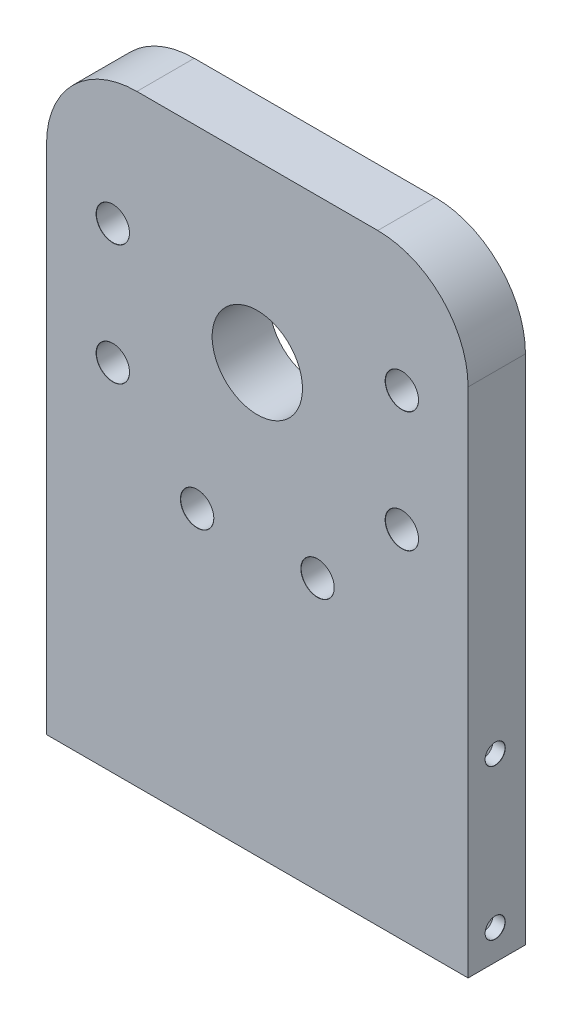
ISO-10303-21;
HEADER;
FILE_DESCRIPTION(('STEP AP214'),'2;1');
FILE_NAME('part.step','',(''),(''),'','','');
FILE_SCHEMA(('AUTOMOTIVE_DESIGN { 1 0 10303 214 1 1 1 1 }'));
ENDSEC;
DATA;
#1=APPLICATION_CONTEXT('core data for automotive mechanical design processes');
#2=APPLICATION_PROTOCOL_DEFINITION('international standard','automotive_design',2000,#1);
#3=PRODUCT_CONTEXT('',#1,'mechanical');
#4=PRODUCT('Part','Part','',(#3));
#5=PRODUCT_RELATED_PRODUCT_CATEGORY('part','',(#4));
#6=PRODUCT_DEFINITION_FORMATION('','',#4);
#7=PRODUCT_DEFINITION_CONTEXT('part definition',#1,'design');
#8=PRODUCT_DEFINITION('design','',#6,#7);
#9=PRODUCT_DEFINITION_SHAPE('','',#8);
#10=(LENGTH_UNIT() NAMED_UNIT(*) SI_UNIT(.MILLI.,.METRE.));
#11=(NAMED_UNIT(*) PLANE_ANGLE_UNIT() SI_UNIT($,.RADIAN.));
#12=(NAMED_UNIT(*) SI_UNIT($,.STERADIAN.) SOLID_ANGLE_UNIT());
#13=UNCERTAINTY_MEASURE_WITH_UNIT(LENGTH_MEASURE(1.E-05),#10,'distance_accuracy_value','');
#14=(GEOMETRIC_REPRESENTATION_CONTEXT(3) GLOBAL_UNCERTAINTY_ASSIGNED_CONTEXT((#13)) GLOBAL_UNIT_ASSIGNED_CONTEXT((#10,
#11,#12)) REPRESENTATION_CONTEXT('',''));
#15=CARTESIAN_POINT('',(0.,0.,0.));
#16=DIRECTION('',(0.,0.,1.));
#17=DIRECTION('',(1.,0.,0.));
#18=AXIS2_PLACEMENT_3D('',#15,#16,#17);
#19=CARTESIAN_POINT('',(35.,-50.,9.525));
#20=DIRECTION('',(-1.,0.,0.));
#21=DIRECTION('',(0.,0.,1.));
#22=AXIS2_PLACEMENT_3D('',#19,#20,#21);
#23=PLANE('',#22);
#24=CARTESIAN_POINT('',(35.,-45.,5.025));
#25=DIRECTION('',(1.,0.,0.));
#26=DIRECTION('',(0.,0.,-1.));
#27=AXIS2_PLACEMENT_3D('',#24,#25,#26);
#28=CIRCLE('',#27,1.675);
#29=CARTESIAN_POINT('',(35.,-45.,3.35));
#30=VERTEX_POINT('',#29);
#31=EDGE_CURVE('E148',#30,#30,#28,.T.);
#32=ORIENTED_EDGE('',*,*,#31,.F.);
#33=EDGE_LOOP('',(#32));
#34=FACE_BOUND('',#33,.T.);
#35=CARTESIAN_POINT('',(35.,-20.,5.025));
#36=DIRECTION('',(1.,0.,0.));
#37=DIRECTION('',(0.,0.,-1.));
#38=AXIS2_PLACEMENT_3D('',#35,#36,#37);
#39=CIRCLE('',#38,1.675);
#40=CARTESIAN_POINT('',(35.,-20.,3.35));
#41=VERTEX_POINT('',#40);
#42=EDGE_CURVE('E160',#41,#41,#39,.T.);
#43=ORIENTED_EDGE('',*,*,#42,.F.);
#44=EDGE_LOOP('',(#43));
#45=FACE_BOUND('',#44,.T.);
#46=DIRECTION('',(0.,1.,0.));
#47=VECTOR('',#46,1.);
#48=CARTESIAN_POINT('',(35.,-50.,0.));
#49=LINE('',#48,#47);
#50=CARTESIAN_POINT('',(35.,-50.,0.));
#51=VERTEX_POINT('',#50);
#52=CARTESIAN_POINT('',(35.,35.,0.));
#53=VERTEX_POINT('',#52);
#54=EDGE_CURVE('E294',#51,#53,#49,.T.);
#55=ORIENTED_EDGE('',*,*,#54,.T.);
#56=DIRECTION('',(0.,0.,-1.));
#57=VECTOR('',#56,1.);
#58=CARTESIAN_POINT('',(35.,35.,9.525));
#59=LINE('',#58,#57);
#60=CARTESIAN_POINT('',(35.,35.,9.525));
#61=VERTEX_POINT('',#60);
#62=EDGE_CURVE('E12',#53,#61,#59,.F.);
#63=ORIENTED_EDGE('',*,*,#62,.T.);
#64=DIRECTION('',(0.,1.,0.));
#65=VECTOR('',#64,1.);
#66=CARTESIAN_POINT('',(35.,-50.,9.525));
#67=LINE('',#66,#65);
#68=CARTESIAN_POINT('',(35.,-50.,9.525));
#69=VERTEX_POINT('',#68);
#70=EDGE_CURVE('E273',#69,#61,#67,.T.);
#71=ORIENTED_EDGE('',*,*,#70,.F.);
#72=DIRECTION('',(0.,0.,-1.));
#73=VECTOR('',#72,1.);
#74=CARTESIAN_POINT('',(35.,-50.,9.525));
#75=LINE('',#74,#73);
#76=EDGE_CURVE('E274',#69,#51,#75,.T.);
#77=ORIENTED_EDGE('',*,*,#76,.T.);
#78=EDGE_LOOP('',(#55,#63,#71,#77));
#79=FACE_BOUND('',#78,.T.);
#80=ADVANCED_FACE('F45',(#34,#45,#79),#23,.F.);
#81=CARTESIAN_POINT('',(-35.,50.,9.525));
#82=DIRECTION('',(0.,-1.,0.));
#83=DIRECTION('',(0.,0.,-1.));
#84=AXIS2_PLACEMENT_3D('',#81,#82,#83);
#85=PLANE('',#84);
#86=DIRECTION('',(-1.,0.,0.));
#87=VECTOR('',#86,1.);
#88=CARTESIAN_POINT('',(-35.,50.,0.));
#89=LINE('',#88,#87);
#90=CARTESIAN_POINT('',(20.,50.,0.));
#91=VERTEX_POINT('',#90);
#92=CARTESIAN_POINT('',(-20.,50.,0.));
#93=VERTEX_POINT('',#92);
#94=EDGE_CURVE('E267',#91,#93,#89,.T.);
#95=ORIENTED_EDGE('',*,*,#94,.T.);
#96=DIRECTION('',(0.,0.,-1.));
#97=VECTOR('',#96,1.);
#98=CARTESIAN_POINT('',(-20.,50.,9.525));
#99=LINE('',#98,#97);
#100=CARTESIAN_POINT('',(-20.,50.,9.525));
#101=VERTEX_POINT('',#100);
#102=EDGE_CURVE('E67',#93,#101,#99,.F.);
#103=ORIENTED_EDGE('',*,*,#102,.T.);
#104=DIRECTION('',(-1.,0.,0.));
#105=VECTOR('',#104,1.);
#106=CARTESIAN_POINT('',(-35.,50.,9.525));
#107=LINE('',#106,#105);
#108=CARTESIAN_POINT('',(20.,50.,9.525));
#109=VERTEX_POINT('',#108);
#110=EDGE_CURVE('E304',#109,#101,#107,.T.);
#111=ORIENTED_EDGE('',*,*,#110,.F.);
#112=DIRECTION('',(0.,0.,-1.));
#113=VECTOR('',#112,1.);
#114=CARTESIAN_POINT('',(20.,50.,9.525));
#115=LINE('',#114,#113);
#116=EDGE_CURVE('E354',#109,#91,#115,.T.);
#117=ORIENTED_EDGE('',*,*,#116,.T.);
#118=EDGE_LOOP('',(#95,#103,#111,#117));
#119=FACE_BOUND('',#118,.T.);
#120=ADVANCED_FACE('F355',(#119),#85,.F.);
#121=CARTESIAN_POINT('',(-35.,-50.,9.525));
#122=DIRECTION('',(1.,0.,0.));
#123=DIRECTION('',(0.,0.,-1.));
#124=AXIS2_PLACEMENT_3D('',#121,#122,#123);
#125=PLANE('',#124);
#126=CARTESIAN_POINT('',(-35.,-45.,5.025));
#127=DIRECTION('',(-1.,0.,0.));
#128=DIRECTION('',(0.,0.,1.));
#129=AXIS2_PLACEMENT_3D('',#126,#127,#128);
#130=CIRCLE('',#129,1.675);
#131=CARTESIAN_POINT('',(-35.,-45.,6.7));
#132=VERTEX_POINT('',#131);
#133=EDGE_CURVE('E137',#132,#132,#130,.T.);
#134=ORIENTED_EDGE('',*,*,#133,.F.);
#135=EDGE_LOOP('',(#134));
#136=FACE_BOUND('',#135,.T.);
#137=CARTESIAN_POINT('',(-35.,-20.,5.025));
#138=DIRECTION('',(-1.,0.,0.));
#139=DIRECTION('',(0.,0.,1.));
#140=AXIS2_PLACEMENT_3D('',#137,#138,#139);
#141=CIRCLE('',#140,1.675);
#142=CARTESIAN_POINT('',(-35.,-20.,6.7));
#143=VERTEX_POINT('',#142);
#144=EDGE_CURVE('E128',#143,#143,#141,.T.);
#145=ORIENTED_EDGE('',*,*,#144,.F.);
#146=EDGE_LOOP('',(#145));
#147=FACE_BOUND('',#146,.T.);
#148=DIRECTION('',(0.,-1.,0.));
#149=VECTOR('',#148,1.);
#150=CARTESIAN_POINT('',(-35.,-50.,9.525));
#151=LINE('',#150,#149);
#152=CARTESIAN_POINT('',(-35.,35.,9.525));
#153=VERTEX_POINT('',#152);
#154=CARTESIAN_POINT('',(-35.,-50.,9.525));
#155=VERTEX_POINT('',#154);
#156=EDGE_CURVE('E301',#153,#155,#151,.T.);
#157=ORIENTED_EDGE('',*,*,#156,.F.);
#158=DIRECTION('',(0.,0.,-1.));
#159=VECTOR('',#158,1.);
#160=CARTESIAN_POINT('',(-35.,35.,9.525));
#161=LINE('',#160,#159);
#162=CARTESIAN_POINT('',(-35.,35.,0.));
#163=VERTEX_POINT('',#162);
#164=EDGE_CURVE('E283',#153,#163,#161,.T.);
#165=ORIENTED_EDGE('',*,*,#164,.T.);
#166=DIRECTION('',(0.,-1.,0.));
#167=VECTOR('',#166,1.);
#168=CARTESIAN_POINT('',(-35.,-50.,0.));
#169=LINE('',#168,#167);
#170=CARTESIAN_POINT('',(-35.,-50.,0.));
#171=VERTEX_POINT('',#170);
#172=EDGE_CURVE('E262',#163,#171,#169,.T.);
#173=ORIENTED_EDGE('',*,*,#172,.T.);
#174=DIRECTION('',(0.,0.,-1.));
#175=VECTOR('',#174,1.);
#176=CARTESIAN_POINT('',(-35.,-50.,9.525));
#177=LINE('',#176,#175);
#178=EDGE_CURVE('E278',#155,#171,#177,.T.);
#179=ORIENTED_EDGE('',*,*,#178,.F.);
#180=EDGE_LOOP('',(#157,#165,#173,#179));
#181=FACE_BOUND('',#180,.T.);
#182=ADVANCED_FACE('F337',(#136,#147,#181),#125,.F.);
#183=CARTESIAN_POINT('',(-35.,-50.,9.525));
#184=DIRECTION('',(0.,1.,0.));
#185=DIRECTION('',(0.,0.,1.));
#186=AXIS2_PLACEMENT_3D('',#183,#184,#185);
#187=PLANE('',#186);
#188=CARTESIAN_POINT('',(-20.,-50.,4.7625));
#189=DIRECTION('',(0.,-1.,0.));
#190=DIRECTION('',(0.,0.,-1.));
#191=AXIS2_PLACEMENT_3D('',#188,#189,#190);
#192=CIRCLE('',#191,1.675);
#193=CARTESIAN_POINT('',(-20.,-50.,3.0875));
#194=VERTEX_POINT('',#193);
#195=EDGE_CURVE('E255',#194,#194,#192,.T.);
#196=ORIENTED_EDGE('',*,*,#195,.F.);
#197=EDGE_LOOP('',(#196));
#198=FACE_BOUND('',#197,.T.);
#199=CARTESIAN_POINT('',(20.,-50.,4.7625));
#200=DIRECTION('',(0.,-1.,0.));
#201=DIRECTION('',(0.,0.,-1.));
#202=AXIS2_PLACEMENT_3D('',#199,#200,#201);
#203=CIRCLE('',#202,1.675);
#204=CARTESIAN_POINT('',(20.,-50.,3.0875));
#205=VERTEX_POINT('',#204);
#206=EDGE_CURVE('E316',#205,#205,#203,.T.);
#207=ORIENTED_EDGE('',*,*,#206,.F.);
#208=EDGE_LOOP('',(#207));
#209=FACE_BOUND('',#208,.T.);
#210=DIRECTION('',(1.,0.,0.));
#211=VECTOR('',#210,1.);
#212=CARTESIAN_POINT('',(-35.,-50.,0.));
#213=LINE('',#212,#211);
#214=EDGE_CURVE('E266',#171,#51,#213,.T.);
#215=ORIENTED_EDGE('',*,*,#214,.T.);
#216=ORIENTED_EDGE('',*,*,#76,.F.);
#217=DIRECTION('',(1.,0.,0.));
#218=VECTOR('',#217,1.);
#219=CARTESIAN_POINT('',(-35.,-50.,9.525));
#220=LINE('',#219,#218);
#221=EDGE_CURVE('E279',#155,#69,#220,.T.);
#222=ORIENTED_EDGE('',*,*,#221,.F.);
#223=ORIENTED_EDGE('',*,*,#178,.T.);
#224=EDGE_LOOP('',(#215,#216,#222,#223));
#225=FACE_BOUND('',#224,.T.);
#226=ADVANCED_FACE('F333',(#198,#209,#225),#187,.F.);
#227=CARTESIAN_POINT('',(0.,0.,9.525));
#228=DIRECTION('',(0.,0.,-1.));
#229=DIRECTION('',(-1.,0.,0.));
#230=AXIS2_PLACEMENT_3D('',#227,#228,#229);
#231=PLANE('',#230);
#232=CARTESIAN_POINT('',(-10.,-4.99999999999999,9.525));
#233=DIRECTION('',(0.,0.,1.));
#234=DIRECTION('',(1.,0.,0.));
#235=AXIS2_PLACEMENT_3D('',#232,#233,#234);
#236=CIRCLE('',#235,2.775);
#237=CARTESIAN_POINT('',(-7.225,-4.99999999999999,9.525));
#238=VERTEX_POINT('',#237);
#239=EDGE_CURVE('E172',#238,#238,#236,.T.);
#240=ORIENTED_EDGE('',*,*,#239,.F.);
#241=EDGE_LOOP('',(#240));
#242=FACE_BOUND('',#241,.T.);
#243=CARTESIAN_POINT('',(10.,-4.99999999999999,9.525));
#244=DIRECTION('',(0.,0.,1.));
#245=DIRECTION('',(1.,0.,0.));
#246=AXIS2_PLACEMENT_3D('',#243,#244,#245);
#247=CIRCLE('',#246,2.775);
#248=CARTESIAN_POINT('',(12.775,-4.99999999999999,9.525));
#249=VERTEX_POINT('',#248);
#250=EDGE_CURVE('E185',#249,#249,#247,.T.);
#251=ORIENTED_EDGE('',*,*,#250,.F.);
#252=EDGE_LOOP('',(#251));
#253=FACE_BOUND('',#252,.T.);
#254=CARTESIAN_POINT('',(24.,9.00000000000001,9.525));
#255=DIRECTION('',(0.,0.,1.));
#256=DIRECTION('',(1.,0.,0.));
#257=AXIS2_PLACEMENT_3D('',#254,#255,#256);
#258=CIRCLE('',#257,2.775);
#259=CARTESIAN_POINT('',(26.775,9.00000000000001,9.525));
#260=VERTEX_POINT('',#259);
#261=EDGE_CURVE('E198',#260,#260,#258,.T.);
#262=ORIENTED_EDGE('',*,*,#261,.F.);
#263=EDGE_LOOP('',(#262));
#264=FACE_BOUND('',#263,.T.);
#265=CARTESIAN_POINT('',(24.,29.,9.525));
#266=DIRECTION('',(0.,0.,1.));
#267=DIRECTION('',(1.,0.,0.));
#268=AXIS2_PLACEMENT_3D('',#265,#266,#267);
#269=CIRCLE('',#268,2.775);
#270=CARTESIAN_POINT('',(26.775,29.,9.525));
#271=VERTEX_POINT('',#270);
#272=EDGE_CURVE('E211',#271,#271,#269,.T.);
#273=ORIENTED_EDGE('',*,*,#272,.F.);
#274=EDGE_LOOP('',(#273));
#275=FACE_BOUND('',#274,.T.);
#276=CARTESIAN_POINT('',(-24.,9.00000000000001,9.525));
#277=DIRECTION('',(0.,0.,1.));
#278=DIRECTION('',(1.,0.,0.));
#279=AXIS2_PLACEMENT_3D('',#276,#277,#278);
#280=CIRCLE('',#279,2.775);
#281=CARTESIAN_POINT('',(-21.225,9.00000000000001,9.525));
#282=VERTEX_POINT('',#281);
#283=EDGE_CURVE('E224',#282,#282,#280,.T.);
#284=ORIENTED_EDGE('',*,*,#283,.F.);
#285=EDGE_LOOP('',(#284));
#286=FACE_BOUND('',#285,.T.);
#287=CARTESIAN_POINT('',(-24.,29.,9.525));
#288=DIRECTION('',(0.,0.,1.));
#289=DIRECTION('',(1.,0.,0.));
#290=AXIS2_PLACEMENT_3D('',#287,#288,#289);
#291=CIRCLE('',#290,2.775);
#292=CARTESIAN_POINT('',(-21.225,29.,9.525));
#293=VERTEX_POINT('',#292);
#294=EDGE_CURVE('E236',#293,#293,#291,.T.);
#295=ORIENTED_EDGE('',*,*,#294,.F.);
#296=EDGE_LOOP('',(#295));
#297=FACE_BOUND('',#296,.T.);
#298=CARTESIAN_POINT('',(0.,21.,9.525));
#299=DIRECTION('',(0.,0.,1.));
#300=DIRECTION('',(1.,0.,0.));
#301=AXIS2_PLACEMENT_3D('',#298,#299,#300);
#302=CIRCLE('',#301,7.5);
#303=CARTESIAN_POINT('',(7.5,21.,9.525));
#304=VERTEX_POINT('',#303);
#305=EDGE_CURVE('E249',#304,#304,#302,.T.);
#306=ORIENTED_EDGE('',*,*,#305,.F.);
#307=EDGE_LOOP('',(#306));
#308=FACE_BOUND('',#307,.T.);
#309=ORIENTED_EDGE('',*,*,#110,.T.);
#310=CARTESIAN_POINT('',(-20.,35.,9.525));
#311=DIRECTION('',(0.,0.,-1.));
#312=DIRECTION('',(-1.,0.,0.));
#313=AXIS2_PLACEMENT_3D('',#310,#311,#312);
#314=CIRCLE('',#313,15.);
#315=EDGE_CURVE('E54',#101,#153,#314,.F.);
#316=ORIENTED_EDGE('',*,*,#315,.T.);
#317=ORIENTED_EDGE('',*,*,#156,.T.);
#318=ORIENTED_EDGE('',*,*,#221,.T.);
#319=ORIENTED_EDGE('',*,*,#70,.T.);
#320=CARTESIAN_POINT('',(20.,35.,9.525));
#321=DIRECTION('',(0.,0.,-1.));
#322=DIRECTION('',(-1.,0.,0.));
#323=AXIS2_PLACEMENT_3D('',#320,#321,#322);
#324=CIRCLE('',#323,15.);
#325=EDGE_CURVE('E359',#61,#109,#324,.F.);
#326=ORIENTED_EDGE('',*,*,#325,.T.);
#327=EDGE_LOOP('',(#309,#316,#317,#318,#319,#326));
#328=FACE_BOUND('',#327,.T.);
#329=ADVANCED_FACE('F336',(#242,#253,#264,#275,#286,#297,#308,#328),#231,.F.);
#330=CARTESIAN_POINT('',(0.,0.,0.));
#331=DIRECTION('',(0.,0.,-1.));
#332=DIRECTION('',(-1.,0.,0.));
#333=AXIS2_PLACEMENT_3D('',#330,#331,#332);
#334=PLANE('',#333);
#335=CARTESIAN_POINT('',(-10.,-4.99999999999999,0.));
#336=DIRECTION('',(0.,0.,1.));
#337=DIRECTION('',(1.,0.,0.));
#338=AXIS2_PLACEMENT_3D('',#335,#336,#337);
#339=CIRCLE('',#338,2.75);
#340=CARTESIAN_POINT('',(-7.25,-4.99999999999999,0.));
#341=VERTEX_POINT('',#340);
#342=EDGE_CURVE('E180',#341,#341,#339,.T.);
#343=ORIENTED_EDGE('',*,*,#342,.T.);
#344=EDGE_LOOP('',(#343));
#345=FACE_BOUND('',#344,.T.);
#346=CARTESIAN_POINT('',(10.,-4.99999999999999,0.));
#347=DIRECTION('',(0.,0.,1.));
#348=DIRECTION('',(1.,0.,0.));
#349=AXIS2_PLACEMENT_3D('',#346,#347,#348);
#350=CIRCLE('',#349,2.75);
#351=CARTESIAN_POINT('',(12.75,-4.99999999999999,0.));
#352=VERTEX_POINT('',#351);
#353=EDGE_CURVE('E193',#352,#352,#350,.T.);
#354=ORIENTED_EDGE('',*,*,#353,.T.);
#355=EDGE_LOOP('',(#354));
#356=FACE_BOUND('',#355,.T.);
#357=CARTESIAN_POINT('',(24.,9.00000000000001,0.));
#358=DIRECTION('',(0.,0.,1.));
#359=DIRECTION('',(1.,0.,0.));
#360=AXIS2_PLACEMENT_3D('',#357,#358,#359);
#361=CIRCLE('',#360,2.75);
#362=CARTESIAN_POINT('',(26.75,9.00000000000001,0.));
#363=VERTEX_POINT('',#362);
#364=EDGE_CURVE('E206',#363,#363,#361,.T.);
#365=ORIENTED_EDGE('',*,*,#364,.T.);
#366=EDGE_LOOP('',(#365));
#367=FACE_BOUND('',#366,.T.);
#368=CARTESIAN_POINT('',(24.,29.,0.));
#369=DIRECTION('',(0.,0.,1.));
#370=DIRECTION('',(1.,0.,0.));
#371=AXIS2_PLACEMENT_3D('',#368,#369,#370);
#372=CIRCLE('',#371,2.75);
#373=CARTESIAN_POINT('',(26.75,29.,0.));
#374=VERTEX_POINT('',#373);
#375=EDGE_CURVE('E219',#374,#374,#372,.T.);
#376=ORIENTED_EDGE('',*,*,#375,.T.);
#377=EDGE_LOOP('',(#376));
#378=FACE_BOUND('',#377,.T.);
#379=CARTESIAN_POINT('',(-24.,9.00000000000001,0.));
#380=DIRECTION('',(0.,0.,1.));
#381=DIRECTION('',(1.,0.,0.));
#382=AXIS2_PLACEMENT_3D('',#379,#380,#381);
#383=CIRCLE('',#382,2.75);
#384=CARTESIAN_POINT('',(-21.25,9.00000000000001,0.));
#385=VERTEX_POINT('',#384);
#386=EDGE_CURVE('E231',#385,#385,#383,.T.);
#387=ORIENTED_EDGE('',*,*,#386,.T.);
#388=EDGE_LOOP('',(#387));
#389=FACE_BOUND('',#388,.T.);
#390=CARTESIAN_POINT('',(-24.,29.,0.));
#391=DIRECTION('',(0.,0.,1.));
#392=DIRECTION('',(1.,0.,0.));
#393=AXIS2_PLACEMENT_3D('',#390,#391,#392);
#394=CIRCLE('',#393,2.75);
#395=CARTESIAN_POINT('',(-21.25,29.,0.));
#396=VERTEX_POINT('',#395);
#397=EDGE_CURVE('E244',#396,#396,#394,.T.);
#398=ORIENTED_EDGE('',*,*,#397,.T.);
#399=EDGE_LOOP('',(#398));
#400=FACE_BOUND('',#399,.T.);
#401=CARTESIAN_POINT('',(0.,21.,0.));
#402=DIRECTION('',(0.,0.,1.));
#403=DIRECTION('',(1.,0.,0.));
#404=AXIS2_PLACEMENT_3D('',#401,#402,#403);
#405=CIRCLE('',#404,7.5);
#406=CARTESIAN_POINT('',(7.5,21.,0.));
#407=VERTEX_POINT('',#406);
#408=EDGE_CURVE('E250',#407,#407,#405,.T.);
#409=ORIENTED_EDGE('',*,*,#408,.T.);
#410=EDGE_LOOP('',(#409));
#411=FACE_BOUND('',#410,.T.);
#412=ORIENTED_EDGE('',*,*,#172,.F.);
#413=CARTESIAN_POINT('',(-20.,35.,0.));
#414=DIRECTION('',(0.,0.,-1.));
#415=DIRECTION('',(-1.,0.,0.));
#416=AXIS2_PLACEMENT_3D('',#413,#414,#415);
#417=CIRCLE('',#416,15.);
#418=EDGE_CURVE('E290',#163,#93,#417,.T.);
#419=ORIENTED_EDGE('',*,*,#418,.T.);
#420=ORIENTED_EDGE('',*,*,#94,.F.);
#421=CARTESIAN_POINT('',(20.,35.,0.));
#422=DIRECTION('',(0.,0.,-1.));
#423=DIRECTION('',(-1.,0.,0.));
#424=AXIS2_PLACEMENT_3D('',#421,#422,#423);
#425=CIRCLE('',#424,15.);
#426=EDGE_CURVE('E287',#91,#53,#425,.T.);
#427=ORIENTED_EDGE('',*,*,#426,.T.);
#428=ORIENTED_EDGE('',*,*,#54,.F.);
#429=ORIENTED_EDGE('',*,*,#214,.F.);
#430=EDGE_LOOP('',(#412,#419,#420,#427,#428,#429));
#431=FACE_BOUND('',#430,.T.);
#432=ADVANCED_FACE('F348',(#345,#356,#367,#378,#389,#400,#411,#431),#334,.T.);
#433=CARTESIAN_POINT('',(20.,-48.,4.7625));
#434=DIRECTION('',(0.,-1.,0.));
#435=DIRECTION('',(0.,0.,-1.));
#436=AXIS2_PLACEMENT_3D('',#433,#434,#435);
#437=CONICAL_SURFACE('',#436,1.64999999999999,1.02974425867665);
#438=CARTESIAN_POINT('',(20.,-47.0085799786045,4.7625));
#439=VERTEX_POINT('',#438);
#440=VERTEX_LOOP('',#439);
#441=FACE_BOUND('',#440,.T.);
#442=CARTESIAN_POINT('',(20.,-48.,4.7625));
#443=DIRECTION('',(0.,-1.,0.));
#444=DIRECTION('',(0.,0.,-1.));
#445=AXIS2_PLACEMENT_3D('',#442,#443,#444);
#446=CIRCLE('',#445,1.64999999999999);
#447=CARTESIAN_POINT('',(20.,-48.,3.11250000000001));
#448=VERTEX_POINT('',#447);
#449=EDGE_CURVE('E298',#448,#448,#446,.T.);
#450=ORIENTED_EDGE('',*,*,#449,.T.);
#451=EDGE_LOOP('',(#450));
#452=FACE_BOUND('',#451,.T.);
#453=ADVANCED_FACE('F394',(#441,#452),#437,.F.);
#454=CARTESIAN_POINT('',(20.,-50.,4.7625));
#455=DIRECTION('',(0.,-1.,0.));
#456=DIRECTION('',(0.,0.,-1.));
#457=AXIS2_PLACEMENT_3D('',#454,#455,#456);
#458=CYLINDRICAL_SURFACE('',#457,1.64999999999999);
#459=ORIENTED_EDGE('',*,*,#449,.F.);
#460=EDGE_LOOP('',(#459));
#461=FACE_BOUND('',#460,.T.);
#462=CARTESIAN_POINT('',(20.,-49.975,4.7625));
#463=DIRECTION('',(0.,-1.,0.));
#464=DIRECTION('',(0.,0.,-1.));
#465=AXIS2_PLACEMENT_3D('',#462,#463,#464);
#466=CIRCLE('',#465,1.65);
#467=CARTESIAN_POINT('',(20.,-49.975,3.1125));
#468=VERTEX_POINT('',#467);
#469=EDGE_CURVE('E312',#468,#468,#466,.T.);
#470=ORIENTED_EDGE('',*,*,#469,.T.);
#471=EDGE_LOOP('',(#470));
#472=FACE_BOUND('',#471,.T.);
#473=ADVANCED_FACE('F401',(#461,#472),#458,.F.);
#474=CARTESIAN_POINT('',(20.,-50.,4.7625));
#475=DIRECTION('',(0.,-1.,0.));
#476=DIRECTION('',(0.,0.,-1.));
#477=AXIS2_PLACEMENT_3D('',#474,#475,#476);
#478=CONICAL_SURFACE('',#477,1.675,0.785398163397518);
#479=ORIENTED_EDGE('',*,*,#469,.F.);
#480=EDGE_LOOP('',(#479));
#481=FACE_BOUND('',#480,.T.);
#482=ORIENTED_EDGE('',*,*,#206,.T.);
#483=EDGE_LOOP('',(#482));
#484=FACE_BOUND('',#483,.T.);
#485=ADVANCED_FACE('F405',(#481,#484),#478,.F.);
#486=CARTESIAN_POINT('',(-20.,-48.,4.7625));
#487=DIRECTION('',(0.,-1.,0.));
#488=DIRECTION('',(0.,0.,-1.));
#489=AXIS2_PLACEMENT_3D('',#486,#487,#488);
#490=CONICAL_SURFACE('',#489,1.64999999999999,1.02974425867665);
#491=CARTESIAN_POINT('',(-20.,-47.0085799786045,4.7625));
#492=VERTEX_POINT('',#491);
#493=VERTEX_LOOP('',#492);
#494=FACE_BOUND('',#493,.T.);
#495=CARTESIAN_POINT('',(-20.,-48.,4.7625));
#496=DIRECTION('',(0.,-1.,0.));
#497=DIRECTION('',(0.,0.,-1.));
#498=AXIS2_PLACEMENT_3D('',#495,#496,#497);
#499=CIRCLE('',#498,1.64999999999999);
#500=CARTESIAN_POINT('',(-20.,-48.,3.11250000000001));
#501=VERTEX_POINT('',#500);
#502=EDGE_CURVE('E320',#501,#501,#499,.T.);
#503=ORIENTED_EDGE('',*,*,#502,.T.);
#504=EDGE_LOOP('',(#503));
#505=FACE_BOUND('',#504,.T.);
#506=ADVANCED_FACE('F409',(#494,#505),#490,.F.);
#507=CARTESIAN_POINT('',(-20.,-50.,4.7625));
#508=DIRECTION('',(0.,-1.,0.));
#509=DIRECTION('',(0.,0.,-1.));
#510=AXIS2_PLACEMENT_3D('',#507,#508,#509);
#511=CYLINDRICAL_SURFACE('',#510,1.64999999999999);
#512=ORIENTED_EDGE('',*,*,#502,.F.);
#513=EDGE_LOOP('',(#512));
#514=FACE_BOUND('',#513,.T.);
#515=CARTESIAN_POINT('',(-20.,-49.975,4.7625));
#516=DIRECTION('',(0.,-1.,0.));
#517=DIRECTION('',(0.,0.,-1.));
#518=AXIS2_PLACEMENT_3D('',#515,#516,#517);
#519=CIRCLE('',#518,1.65);
#520=CARTESIAN_POINT('',(-20.,-49.975,3.1125));
#521=VERTEX_POINT('',#520);
#522=EDGE_CURVE('E324',#521,#521,#519,.T.);
#523=ORIENTED_EDGE('',*,*,#522,.T.);
#524=EDGE_LOOP('',(#523));
#525=FACE_BOUND('',#524,.T.);
#526=ADVANCED_FACE('F413',(#514,#525),#511,.F.);
#527=CARTESIAN_POINT('',(-20.,-50.,4.7625));
#528=DIRECTION('',(0.,-1.,0.));
#529=DIRECTION('',(0.,0.,-1.));
#530=AXIS2_PLACEMENT_3D('',#527,#528,#529);
#531=CONICAL_SURFACE('',#530,1.675,0.785398163397518);
#532=ORIENTED_EDGE('',*,*,#522,.F.);
#533=EDGE_LOOP('',(#532));
#534=FACE_BOUND('',#533,.T.);
#535=ORIENTED_EDGE('',*,*,#195,.T.);
#536=EDGE_LOOP('',(#535));
#537=FACE_BOUND('',#536,.T.);
#538=ADVANCED_FACE('F331',(#534,#537),#531,.F.);
#539=CARTESIAN_POINT('',(0.,21.,0.));
#540=DIRECTION('',(0.,0.,1.));
#541=DIRECTION('',(1.,0.,0.));
#542=AXIS2_PLACEMENT_3D('',#539,#540,#541);
#543=CYLINDRICAL_SURFACE('',#542,7.5);
#544=CARTESIAN_POINT('',(7.5,21.,0.));
#545=CARTESIAN_POINT('',(7.5,21.,0.0992187499999999));
#546=CARTESIAN_POINT('',(7.5,21.,0.1984375));
#547=CARTESIAN_POINT('',(7.5,21.,0.396875));
#548=CARTESIAN_POINT('',(7.5,21.,0.49609375));
#549=CARTESIAN_POINT('',(7.5,21.,0.69453125));
#550=CARTESIAN_POINT('',(7.5,21.,0.79375));
#551=CARTESIAN_POINT('',(7.5,21.,0.9921875));
#552=CARTESIAN_POINT('',(7.5,21.,1.09140625));
#553=CARTESIAN_POINT('',(7.5,21.,1.28984375));
#554=CARTESIAN_POINT('',(7.5,21.,1.3890625));
#555=CARTESIAN_POINT('',(7.5,21.,1.5875));
#556=CARTESIAN_POINT('',(7.5,21.,1.68671875));
#557=CARTESIAN_POINT('',(7.5,21.,1.88515625));
#558=CARTESIAN_POINT('',(7.5,21.,1.984375));
#559=CARTESIAN_POINT('',(7.5,21.,2.1828125));
#560=CARTESIAN_POINT('',(7.5,21.,2.28203125));
#561=CARTESIAN_POINT('',(7.5,21.,2.48046875));
#562=CARTESIAN_POINT('',(7.5,21.,2.5796875));
#563=CARTESIAN_POINT('',(7.5,21.,2.778125));
#564=CARTESIAN_POINT('',(7.5,21.,2.87734375));
#565=CARTESIAN_POINT('',(7.5,21.,3.07578125));
#566=CARTESIAN_POINT('',(7.5,21.,3.175));
#567=CARTESIAN_POINT('',(7.5,21.,3.3734375));
#568=CARTESIAN_POINT('',(7.5,21.,3.47265625));
#569=CARTESIAN_POINT('',(7.5,21.,3.67109375));
#570=CARTESIAN_POINT('',(7.5,21.,3.7703125));
#571=CARTESIAN_POINT('',(7.5,21.,3.96875));
#572=CARTESIAN_POINT('',(7.5,21.,4.06796875));
#573=CARTESIAN_POINT('',(7.5,21.,4.26640625));
#574=CARTESIAN_POINT('',(7.5,21.,4.365625));
#575=CARTESIAN_POINT('',(7.5,21.,4.5640625));
#576=CARTESIAN_POINT('',(7.5,21.,4.66328125));
#577=CARTESIAN_POINT('',(7.5,21.,4.86171875));
#578=CARTESIAN_POINT('',(7.5,21.,4.9609375));
#579=CARTESIAN_POINT('',(7.5,21.,5.159375));
#580=CARTESIAN_POINT('',(7.5,21.,5.25859375));
#581=CARTESIAN_POINT('',(7.5,21.,5.45703125));
#582=CARTESIAN_POINT('',(7.5,21.,5.55625));
#583=CARTESIAN_POINT('',(7.5,21.,5.7546875));
#584=CARTESIAN_POINT('',(7.5,21.,5.85390625));
#585=CARTESIAN_POINT('',(7.5,21.,6.05234375));
#586=CARTESIAN_POINT('',(7.5,21.,6.1515625));
#587=CARTESIAN_POINT('',(7.5,21.,6.35));
#588=CARTESIAN_POINT('',(7.5,21.,6.44921875));
#589=CARTESIAN_POINT('',(7.5,21.,6.64765625));
#590=CARTESIAN_POINT('',(7.5,21.,6.746875));
#591=CARTESIAN_POINT('',(7.5,21.,6.9453125));
#592=CARTESIAN_POINT('',(7.5,21.,7.04453125));
#593=CARTESIAN_POINT('',(7.5,21.,7.24296875));
#594=CARTESIAN_POINT('',(7.5,21.,7.3421875));
#595=CARTESIAN_POINT('',(7.5,21.,7.540625));
#596=CARTESIAN_POINT('',(7.5,21.,7.63984375));
#597=CARTESIAN_POINT('',(7.5,21.,7.83828125));
#598=CARTESIAN_POINT('',(7.5,21.,7.9375));
#599=CARTESIAN_POINT('',(7.5,21.,8.1359375));
#600=CARTESIAN_POINT('',(7.5,21.,8.23515625));
#601=CARTESIAN_POINT('',(7.5,21.,8.43359375));
#602=CARTESIAN_POINT('',(7.5,21.,8.5328125));
#603=CARTESIAN_POINT('',(7.5,21.,8.73125));
#604=CARTESIAN_POINT('',(7.5,21.,8.83046875));
#605=CARTESIAN_POINT('',(7.5,21.,9.02890625));
#606=CARTESIAN_POINT('',(7.5,21.,9.128125));
#607=CARTESIAN_POINT('',(7.5,21.,9.3265625));
#608=CARTESIAN_POINT('',(7.5,21.,9.42578125));
#609=CARTESIAN_POINT('',(7.5,21.,9.525));
#610=B_SPLINE_CURVE_WITH_KNOTS('',3,(#544,#545,#546,#547,#548,#549,#550,#551,#552,#553,#554,
#555,#556,#557,#558,#559,#560,#561,#562,#563,#564,#565,#566,#567,#568,#569,#570,#571,#572,#573,
#574,#575,#576,#577,#578,#579,#580,#581,#582,#583,#584,#585,#586,#587,#588,#589,#590,#591,#592,
#593,#594,#595,#596,#597,#598,#599,#600,#601,#602,#603,#604,#605,#606,#607,#608,#609),
.UNSPECIFIED.,.F.,.F.,(4,2,2,2,2,2,2,2,2,2,2,2,2,2,2,2,2,2,2,2,2,2,2,2,2,2,2,2,2,2,2,2,4),(0.,
0.29765625,0.5953125,0.89296875,1.190625,1.48828125,1.7859375,2.08359375,2.38125,2.67890625,
2.9765625,3.27421875,3.571875,3.86953125,4.1671875,4.46484375,4.7625,5.06015625,5.3578125,
5.65546875,5.953125,6.25078125,6.5484375,6.84609375,7.14375,7.44140625,7.7390625,8.03671875,
8.334375,8.63203125,8.9296875,9.22734375,9.525),.UNSPECIFIED.);
#611=EDGE_CURVE('BSEAM420',#407,#304,#610,.T.);
#612=ORIENTED_EDGE('',*,*,#408,.F.);
#613=ORIENTED_EDGE('',*,*,#305,.T.);
#614=ORIENTED_EDGE('',*,*,#611,.T.);
#615=ORIENTED_EDGE('',*,*,#611,.F.);
#616=EDGE_LOOP('',(#612,#614,#613,#615));
#617=FACE_BOUND('',#616,.T.);
#618=ADVANCED_FACE('F420',(#617),#543,.F.);
#619=CARTESIAN_POINT('',(-24.,29.,9.525));
#620=DIRECTION('',(0.,0.,1.));
#621=DIRECTION('',(1.,0.,0.));
#622=AXIS2_PLACEMENT_3D('',#619,#620,#621);
#623=CYLINDRICAL_SURFACE('',#622,2.75);
#624=ORIENTED_EDGE('',*,*,#397,.F.);
#625=EDGE_LOOP('',(#624));
#626=FACE_BOUND('',#625,.T.);
#627=CARTESIAN_POINT('',(-24.,29.,9.5));
#628=DIRECTION('',(0.,0.,1.));
#629=DIRECTION('',(1.,0.,0.));
#630=AXIS2_PLACEMENT_3D('',#627,#628,#629);
#631=CIRCLE('',#630,2.75);
#632=CARTESIAN_POINT('',(-21.25,29.,9.5));
#633=VERTEX_POINT('',#632);
#634=EDGE_CURVE('E241',#633,#633,#631,.T.);
#635=ORIENTED_EDGE('',*,*,#634,.T.);
#636=EDGE_LOOP('',(#635));
#637=FACE_BOUND('',#636,.T.);
#638=ADVANCED_FACE('F424',(#626,#637),#623,.F.);
#639=CARTESIAN_POINT('',(-24.,29.,9.525));
#640=DIRECTION('',(0.,0.,1.));
#641=DIRECTION('',(1.,0.,0.));
#642=AXIS2_PLACEMENT_3D('',#639,#640,#641);
#643=CONICAL_SURFACE('',#642,2.775,0.785398163397448);
#644=ORIENTED_EDGE('',*,*,#634,.F.);
#645=EDGE_LOOP('',(#644));
#646=FACE_BOUND('',#645,.T.);
#647=ORIENTED_EDGE('',*,*,#294,.T.);
#648=EDGE_LOOP('',(#647));
#649=FACE_BOUND('',#648,.T.);
#650=ADVANCED_FACE('F428',(#646,#649),#643,.F.);
#651=CARTESIAN_POINT('',(-24.,9.00000000000001,9.525));
#652=DIRECTION('',(0.,0.,1.));
#653=DIRECTION('',(1.,0.,0.));
#654=AXIS2_PLACEMENT_3D('',#651,#652,#653);
#655=CYLINDRICAL_SURFACE('',#654,2.75);
#656=ORIENTED_EDGE('',*,*,#386,.F.);
#657=EDGE_LOOP('',(#656));
#658=FACE_BOUND('',#657,.T.);
#659=CARTESIAN_POINT('',(-24.,9.00000000000001,9.5));
#660=DIRECTION('',(0.,0.,1.));
#661=DIRECTION('',(1.,0.,0.));
#662=AXIS2_PLACEMENT_3D('',#659,#660,#661);
#663=CIRCLE('',#662,2.75);
#664=CARTESIAN_POINT('',(-21.25,9.00000000000001,9.5));
#665=VERTEX_POINT('',#664);
#666=EDGE_CURVE('E237',#665,#665,#663,.T.);
#667=ORIENTED_EDGE('',*,*,#666,.T.);
#668=EDGE_LOOP('',(#667));
#669=FACE_BOUND('',#668,.T.);
#670=ADVANCED_FACE('F432',(#658,#669),#655,.F.);
#671=CARTESIAN_POINT('',(-24.,9.00000000000001,9.525));
#672=DIRECTION('',(0.,0.,1.));
#673=DIRECTION('',(1.,0.,0.));
#674=AXIS2_PLACEMENT_3D('',#671,#672,#673);
#675=CONICAL_SURFACE('',#674,2.775,0.785398163397448);
#676=ORIENTED_EDGE('',*,*,#666,.F.);
#677=EDGE_LOOP('',(#676));
#678=FACE_BOUND('',#677,.T.);
#679=ORIENTED_EDGE('',*,*,#283,.T.);
#680=EDGE_LOOP('',(#679));
#681=FACE_BOUND('',#680,.T.);
#682=ADVANCED_FACE('F436',(#678,#681),#675,.F.);
#683=CARTESIAN_POINT('',(24.,29.,9.525));
#684=DIRECTION('',(0.,0.,1.));
#685=DIRECTION('',(1.,0.,0.));
#686=AXIS2_PLACEMENT_3D('',#683,#684,#685);
#687=CYLINDRICAL_SURFACE('',#686,2.75);
#688=ORIENTED_EDGE('',*,*,#375,.F.);
#689=EDGE_LOOP('',(#688));
#690=FACE_BOUND('',#689,.T.);
#691=CARTESIAN_POINT('',(24.,29.,9.5));
#692=DIRECTION('',(0.,0.,1.));
#693=DIRECTION('',(1.,0.,0.));
#694=AXIS2_PLACEMENT_3D('',#691,#692,#693);
#695=CIRCLE('',#694,2.75);
#696=CARTESIAN_POINT('',(26.75,29.,9.5));
#697=VERTEX_POINT('',#696);
#698=EDGE_CURVE('E215',#697,#697,#695,.T.);
#699=ORIENTED_EDGE('',*,*,#698,.T.);
#700=EDGE_LOOP('',(#699));
#701=FACE_BOUND('',#700,.T.);
#702=ADVANCED_FACE('F440',(#690,#701),#687,.F.);
#703=CARTESIAN_POINT('',(24.,29.,9.525));
#704=DIRECTION('',(0.,0.,1.));
#705=DIRECTION('',(1.,0.,0.));
#706=AXIS2_PLACEMENT_3D('',#703,#704,#705);
#707=CONICAL_SURFACE('',#706,2.775,0.785398163397448);
#708=ORIENTED_EDGE('',*,*,#698,.F.);
#709=EDGE_LOOP('',(#708));
#710=FACE_BOUND('',#709,.T.);
#711=ORIENTED_EDGE('',*,*,#272,.T.);
#712=EDGE_LOOP('',(#711));
#713=FACE_BOUND('',#712,.T.);
#714=ADVANCED_FACE('F444',(#710,#713),#707,.F.);
#715=CARTESIAN_POINT('',(24.,9.00000000000001,9.525));
#716=DIRECTION('',(0.,0.,1.));
#717=DIRECTION('',(1.,0.,0.));
#718=AXIS2_PLACEMENT_3D('',#715,#716,#717);
#719=CYLINDRICAL_SURFACE('',#718,2.75);
#720=ORIENTED_EDGE('',*,*,#364,.F.);
#721=EDGE_LOOP('',(#720));
#722=FACE_BOUND('',#721,.T.);
#723=CARTESIAN_POINT('',(24.,9.00000000000001,9.5));
#724=DIRECTION('',(0.,0.,1.));
#725=DIRECTION('',(1.,0.,0.));
#726=AXIS2_PLACEMENT_3D('',#723,#724,#725);
#727=CIRCLE('',#726,2.75);
#728=CARTESIAN_POINT('',(26.75,9.00000000000001,9.5));
#729=VERTEX_POINT('',#728);
#730=EDGE_CURVE('E203',#729,#729,#727,.T.);
#731=ORIENTED_EDGE('',*,*,#730,.T.);
#732=EDGE_LOOP('',(#731));
#733=FACE_BOUND('',#732,.T.);
#734=ADVANCED_FACE('F448',(#722,#733),#719,.F.);
#735=CARTESIAN_POINT('',(24.,9.00000000000001,9.525));
#736=DIRECTION('',(0.,0.,1.));
#737=DIRECTION('',(1.,0.,0.));
#738=AXIS2_PLACEMENT_3D('',#735,#736,#737);
#739=CONICAL_SURFACE('',#738,2.775,0.785398163397448);
#740=ORIENTED_EDGE('',*,*,#730,.F.);
#741=EDGE_LOOP('',(#740));
#742=FACE_BOUND('',#741,.T.);
#743=ORIENTED_EDGE('',*,*,#261,.T.);
#744=EDGE_LOOP('',(#743));
#745=FACE_BOUND('',#744,.T.);
#746=ADVANCED_FACE('F452',(#742,#745),#739,.F.);
#747=CARTESIAN_POINT('',(10.,-4.99999999999999,9.525));
#748=DIRECTION('',(0.,0.,1.));
#749=DIRECTION('',(1.,0.,0.));
#750=AXIS2_PLACEMENT_3D('',#747,#748,#749);
#751=CYLINDRICAL_SURFACE('',#750,2.75);
#752=ORIENTED_EDGE('',*,*,#353,.F.);
#753=EDGE_LOOP('',(#752));
#754=FACE_BOUND('',#753,.T.);
#755=CARTESIAN_POINT('',(10.,-4.99999999999999,9.5));
#756=DIRECTION('',(0.,0.,1.));
#757=DIRECTION('',(1.,0.,0.));
#758=AXIS2_PLACEMENT_3D('',#755,#756,#757);
#759=CIRCLE('',#758,2.75);
#760=CARTESIAN_POINT('',(12.75,-4.99999999999999,9.5));
#761=VERTEX_POINT('',#760);
#762=EDGE_CURVE('E199',#761,#761,#759,.T.);
#763=ORIENTED_EDGE('',*,*,#762,.T.);
#764=EDGE_LOOP('',(#763));
#765=FACE_BOUND('',#764,.T.);
#766=ADVANCED_FACE('F456',(#754,#765),#751,.F.);
#767=CARTESIAN_POINT('',(10.,-4.99999999999999,9.525));
#768=DIRECTION('',(0.,0.,1.));
#769=DIRECTION('',(1.,0.,0.));
#770=AXIS2_PLACEMENT_3D('',#767,#768,#769);
#771=CONICAL_SURFACE('',#770,2.775,0.785398163397414);
#772=ORIENTED_EDGE('',*,*,#762,.F.);
#773=EDGE_LOOP('',(#772));
#774=FACE_BOUND('',#773,.T.);
#775=ORIENTED_EDGE('',*,*,#250,.T.);
#776=EDGE_LOOP('',(#775));
#777=FACE_BOUND('',#776,.T.);
#778=ADVANCED_FACE('F460',(#774,#777),#771,.F.);
#779=CARTESIAN_POINT('',(-10.,-4.99999999999999,9.525));
#780=DIRECTION('',(0.,0.,1.));
#781=DIRECTION('',(1.,0.,0.));
#782=AXIS2_PLACEMENT_3D('',#779,#780,#781);
#783=CYLINDRICAL_SURFACE('',#782,2.75);
#784=ORIENTED_EDGE('',*,*,#342,.F.);
#785=EDGE_LOOP('',(#784));
#786=FACE_BOUND('',#785,.T.);
#787=CARTESIAN_POINT('',(-10.,-4.99999999999999,9.5));
#788=DIRECTION('',(0.,0.,1.));
#789=DIRECTION('',(1.,0.,0.));
#790=AXIS2_PLACEMENT_3D('',#787,#788,#789);
#791=CIRCLE('',#790,2.75);
#792=CARTESIAN_POINT('',(-7.25,-4.99999999999999,9.5));
#793=VERTEX_POINT('',#792);
#794=EDGE_CURVE('E176',#793,#793,#791,.T.);
#795=ORIENTED_EDGE('',*,*,#794,.T.);
#796=EDGE_LOOP('',(#795));
#797=FACE_BOUND('',#796,.T.);
#798=ADVANCED_FACE('F464',(#786,#797),#783,.F.);
#799=CARTESIAN_POINT('',(-10.,-4.99999999999999,9.525));
#800=DIRECTION('',(0.,0.,1.));
#801=DIRECTION('',(1.,0.,0.));
#802=AXIS2_PLACEMENT_3D('',#799,#800,#801);
#803=CONICAL_SURFACE('',#802,2.775,0.785398163397431);
#804=ORIENTED_EDGE('',*,*,#794,.F.);
#805=EDGE_LOOP('',(#804));
#806=FACE_BOUND('',#805,.T.);
#807=ORIENTED_EDGE('',*,*,#239,.T.);
#808=EDGE_LOOP('',(#807));
#809=FACE_BOUND('',#808,.T.);
#810=ADVANCED_FACE('F468',(#806,#809),#803,.F.);
#811=CARTESIAN_POINT('',(33.,-20.,5.025));
#812=DIRECTION('',(1.,0.,0.));
#813=DIRECTION('',(0.,0.,-1.));
#814=AXIS2_PLACEMENT_3D('',#811,#812,#813);
#815=CONICAL_SURFACE('',#814,1.64999999999999,1.02974425867665);
#816=CARTESIAN_POINT('',(32.0085799786045,-20.,5.025));
#817=VERTEX_POINT('',#816);
#818=VERTEX_LOOP('',#817);
#819=FACE_BOUND('',#818,.T.);
#820=CARTESIAN_POINT('',(33.,-20.,5.025));
#821=DIRECTION('',(1.,0.,0.));
#822=DIRECTION('',(0.,0.,-1.));
#823=AXIS2_PLACEMENT_3D('',#820,#821,#822);
#824=CIRCLE('',#823,1.64999999999999);
#825=CARTESIAN_POINT('',(33.,-20.,3.37500000000001));
#826=VERTEX_POINT('',#825);
#827=EDGE_CURVE('E168',#826,#826,#824,.T.);
#828=ORIENTED_EDGE('',*,*,#827,.T.);
#829=EDGE_LOOP('',(#828));
#830=FACE_BOUND('',#829,.T.);
#831=ADVANCED_FACE('F472',(#819,#830),#815,.F.);
#832=CARTESIAN_POINT('',(35.,-20.,5.025));
#833=DIRECTION('',(1.,0.,0.));
#834=DIRECTION('',(0.,0.,-1.));
#835=AXIS2_PLACEMENT_3D('',#832,#833,#834);
#836=CYLINDRICAL_SURFACE('',#835,1.64999999999999);
#837=ORIENTED_EDGE('',*,*,#827,.F.);
#838=EDGE_LOOP('',(#837));
#839=FACE_BOUND('',#838,.T.);
#840=CARTESIAN_POINT('',(34.975,-20.,5.025));
#841=DIRECTION('',(1.,0.,0.));
#842=DIRECTION('',(0.,0.,-1.));
#843=AXIS2_PLACEMENT_3D('',#840,#841,#842);
#844=CIRCLE('',#843,1.65);
#845=CARTESIAN_POINT('',(34.975,-20.,3.375));
#846=VERTEX_POINT('',#845);
#847=EDGE_CURVE('E164',#846,#846,#844,.T.);
#848=ORIENTED_EDGE('',*,*,#847,.T.);
#849=EDGE_LOOP('',(#848));
#850=FACE_BOUND('',#849,.T.);
#851=ADVANCED_FACE('F476',(#839,#850),#836,.F.);
#852=CARTESIAN_POINT('',(35.,-20.,5.025));
#853=DIRECTION('',(1.,0.,0.));
#854=DIRECTION('',(0.,0.,-1.));
#855=AXIS2_PLACEMENT_3D('',#852,#853,#854);
#856=CONICAL_SURFACE('',#855,1.675,0.785398163397518);
#857=ORIENTED_EDGE('',*,*,#847,.F.);
#858=EDGE_LOOP('',(#857));
#859=FACE_BOUND('',#858,.T.);
#860=ORIENTED_EDGE('',*,*,#42,.T.);
#861=EDGE_LOOP('',(#860));
#862=FACE_BOUND('',#861,.T.);
#863=ADVANCED_FACE('F480',(#859,#862),#856,.F.);
#864=CARTESIAN_POINT('',(33.,-45.,5.025));
#865=DIRECTION('',(1.,0.,0.));
#866=DIRECTION('',(0.,0.,-1.));
#867=AXIS2_PLACEMENT_3D('',#864,#865,#866);
#868=CONICAL_SURFACE('',#867,1.64999999999999,1.02974425867665);
#869=CARTESIAN_POINT('',(32.0085799786045,-45.,5.025));
#870=VERTEX_POINT('',#869);
#871=VERTEX_LOOP('',#870);
#872=FACE_BOUND('',#871,.T.);
#873=CARTESIAN_POINT('',(33.,-45.,5.025));
#874=DIRECTION('',(1.,0.,0.));
#875=DIRECTION('',(0.,0.,-1.));
#876=AXIS2_PLACEMENT_3D('',#873,#874,#875);
#877=CIRCLE('',#876,1.64999999999999);
#878=CARTESIAN_POINT('',(33.,-45.,3.37500000000001));
#879=VERTEX_POINT('',#878);
#880=EDGE_CURVE('E156',#879,#879,#877,.T.);
#881=ORIENTED_EDGE('',*,*,#880,.T.);
#882=EDGE_LOOP('',(#881));
#883=FACE_BOUND('',#882,.T.);
#884=ADVANCED_FACE('F484',(#872,#883),#868,.F.);
#885=CARTESIAN_POINT('',(35.,-45.,5.025));
#886=DIRECTION('',(1.,0.,0.));
#887=DIRECTION('',(0.,0.,-1.));
#888=AXIS2_PLACEMENT_3D('',#885,#886,#887);
#889=CYLINDRICAL_SURFACE('',#888,1.65);
#890=ORIENTED_EDGE('',*,*,#880,.F.);
#891=EDGE_LOOP('',(#890));
#892=FACE_BOUND('',#891,.T.);
#893=CARTESIAN_POINT('',(34.975,-45.,5.025));
#894=DIRECTION('',(1.,0.,0.));
#895=DIRECTION('',(0.,0.,-1.));
#896=AXIS2_PLACEMENT_3D('',#893,#894,#895);
#897=CIRCLE('',#896,1.65);
#898=CARTESIAN_POINT('',(34.975,-45.,3.375));
#899=VERTEX_POINT('',#898);
#900=EDGE_CURVE('E152',#899,#899,#897,.T.);
#901=ORIENTED_EDGE('',*,*,#900,.T.);
#902=EDGE_LOOP('',(#901));
#903=FACE_BOUND('',#902,.T.);
#904=ADVANCED_FACE('F488',(#892,#903),#889,.F.);
#905=CARTESIAN_POINT('',(35.,-45.,5.025));
#906=DIRECTION('',(1.,0.,0.));
#907=DIRECTION('',(0.,0.,-1.));
#908=AXIS2_PLACEMENT_3D('',#905,#906,#907);
#909=CONICAL_SURFACE('',#908,1.675,0.785398163397587);
#910=ORIENTED_EDGE('',*,*,#900,.F.);
#911=EDGE_LOOP('',(#910));
#912=FACE_BOUND('',#911,.T.);
#913=ORIENTED_EDGE('',*,*,#31,.T.);
#914=EDGE_LOOP('',(#913));
#915=FACE_BOUND('',#914,.T.);
#916=ADVANCED_FACE('F492',(#912,#915),#909,.F.);
#917=CARTESIAN_POINT('',(-33.,-20.,5.025));
#918=DIRECTION('',(-1.,0.,0.));
#919=DIRECTION('',(0.,0.,1.));
#920=AXIS2_PLACEMENT_3D('',#917,#918,#919);
#921=CONICAL_SURFACE('',#920,1.64999999999999,1.02974425867665);
#922=CARTESIAN_POINT('',(-32.0085799786045,-20.,5.025));
#923=VERTEX_POINT('',#922);
#924=VERTEX_LOOP('',#923);
#925=FACE_BOUND('',#924,.T.);
#926=CARTESIAN_POINT('',(-33.,-20.,5.025));
#927=DIRECTION('',(-1.,0.,0.));
#928=DIRECTION('',(0.,0.,1.));
#929=AXIS2_PLACEMENT_3D('',#926,#927,#928);
#930=CIRCLE('',#929,1.64999999999999);
#931=CARTESIAN_POINT('',(-33.,-20.,6.67499999999999));
#932=VERTEX_POINT('',#931);
#933=EDGE_CURVE('E144',#932,#932,#930,.T.);
#934=ORIENTED_EDGE('',*,*,#933,.T.);
#935=EDGE_LOOP('',(#934));
#936=FACE_BOUND('',#935,.T.);
#937=ADVANCED_FACE('F496',(#925,#936),#921,.F.);
#938=CARTESIAN_POINT('',(-35.,-20.,5.025));
#939=DIRECTION('',(-1.,0.,0.));
#940=DIRECTION('',(0.,0.,1.));
#941=AXIS2_PLACEMENT_3D('',#938,#939,#940);
#942=CYLINDRICAL_SURFACE('',#941,1.64999999999999);
#943=ORIENTED_EDGE('',*,*,#933,.F.);
#944=EDGE_LOOP('',(#943));
#945=FACE_BOUND('',#944,.T.);
#946=CARTESIAN_POINT('',(-34.975,-20.,5.025));
#947=DIRECTION('',(-1.,0.,0.));
#948=DIRECTION('',(0.,0.,1.));
#949=AXIS2_PLACEMENT_3D('',#946,#947,#948);
#950=CIRCLE('',#949,1.65);
#951=CARTESIAN_POINT('',(-34.975,-20.,6.675));
#952=VERTEX_POINT('',#951);
#953=EDGE_CURVE('E134',#952,#952,#950,.T.);
#954=ORIENTED_EDGE('',*,*,#953,.T.);
#955=EDGE_LOOP('',(#954));
#956=FACE_BOUND('',#955,.T.);
#957=ADVANCED_FACE('F500',(#945,#956),#942,.F.);
#958=CARTESIAN_POINT('',(-35.,-20.,5.025));
#959=DIRECTION('',(-1.,0.,0.));
#960=DIRECTION('',(0.,0.,1.));
#961=AXIS2_PLACEMENT_3D('',#958,#959,#960);
#962=CONICAL_SURFACE('',#961,1.675,0.785398163397518);
#963=ORIENTED_EDGE('',*,*,#953,.F.);
#964=EDGE_LOOP('',(#963));
#965=FACE_BOUND('',#964,.T.);
#966=ORIENTED_EDGE('',*,*,#144,.T.);
#967=EDGE_LOOP('',(#966));
#968=FACE_BOUND('',#967,.T.);
#969=ADVANCED_FACE('F121',(#965,#968),#962,.F.);
#970=CARTESIAN_POINT('',(-33.,-45.,5.025));
#971=DIRECTION('',(-1.,0.,0.));
#972=DIRECTION('',(0.,0.,1.));
#973=AXIS2_PLACEMENT_3D('',#970,#971,#972);
#974=CONICAL_SURFACE('',#973,1.64999999999999,1.02974425867665);
#975=CARTESIAN_POINT('',(-32.0085799786045,-45.,5.025));
#976=VERTEX_POINT('',#975);
#977=VERTEX_LOOP('',#976);
#978=FACE_BOUND('',#977,.T.);
#979=CARTESIAN_POINT('',(-33.,-45.,5.025));
#980=DIRECTION('',(-1.,0.,0.));
#981=DIRECTION('',(0.,0.,1.));
#982=AXIS2_PLACEMENT_3D('',#979,#980,#981);
#983=CIRCLE('',#982,1.64999999999999);
#984=CARTESIAN_POINT('',(-33.,-45.,6.67499999999999));
#985=VERTEX_POINT('',#984);
#986=EDGE_CURVE('E125',#985,#985,#983,.T.);
#987=ORIENTED_EDGE('',*,*,#986,.T.);
#988=EDGE_LOOP('',(#987));
#989=FACE_BOUND('',#988,.T.);
#990=ADVANCED_FACE('F117',(#978,#989),#974,.F.);
#991=CARTESIAN_POINT('',(-35.,-45.,5.025));
#992=DIRECTION('',(-1.,0.,0.));
#993=DIRECTION('',(0.,0.,1.));
#994=AXIS2_PLACEMENT_3D('',#991,#992,#993);
#995=CYLINDRICAL_SURFACE('',#994,1.65);
#996=ORIENTED_EDGE('',*,*,#986,.F.);
#997=EDGE_LOOP('',(#996));
#998=FACE_BOUND('',#997,.T.);
#999=CARTESIAN_POINT('',(-34.975,-45.,5.025));
#1000=DIRECTION('',(-1.,0.,0.));
#1001=DIRECTION('',(0.,0.,1.));
#1002=AXIS2_PLACEMENT_3D('',#999,#1000,#1001);
#1003=CIRCLE('',#1002,1.65);
#1004=CARTESIAN_POINT('',(-34.975,-45.,6.675));
#1005=VERTEX_POINT('',#1004);
#1006=EDGE_CURVE('E129',#1005,#1005,#1003,.T.);
#1007=ORIENTED_EDGE('',*,*,#1006,.T.);
#1008=EDGE_LOOP('',(#1007));
#1009=FACE_BOUND('',#1008,.T.);
#1010=ADVANCED_FACE('F120',(#998,#1009),#995,.F.);
#1011=CARTESIAN_POINT('',(-35.,-45.,5.025));
#1012=DIRECTION('',(-1.,0.,0.));
#1013=DIRECTION('',(0.,0.,1.));
#1014=AXIS2_PLACEMENT_3D('',#1011,#1012,#1013);
#1015=CONICAL_SURFACE('',#1014,1.675,0.785398163397587);
#1016=ORIENTED_EDGE('',*,*,#1006,.F.);
#1017=EDGE_LOOP('',(#1016));
#1018=FACE_BOUND('',#1017,.T.);
#1019=ORIENTED_EDGE('',*,*,#133,.T.);
#1020=EDGE_LOOP('',(#1019));
#1021=FACE_BOUND('',#1020,.T.);
#1022=ADVANCED_FACE('F372',(#1018,#1021),#1015,.F.);
#1023=CARTESIAN_POINT('',(-20.,35.,9.525));
#1024=DIRECTION('',(0.,0.,-1.));
#1025=DIRECTION('',(-1.,0.,0.));
#1026=AXIS2_PLACEMENT_3D('',#1023,#1024,#1025);
#1027=CYLINDRICAL_SURFACE('',#1026,15.);
#1028=ORIENTED_EDGE('',*,*,#315,.F.);
#1029=ORIENTED_EDGE('',*,*,#102,.F.);
#1030=ORIENTED_EDGE('',*,*,#418,.F.);
#1031=ORIENTED_EDGE('',*,*,#164,.F.);
#1032=EDGE_LOOP('',(#1028,#1029,#1030,#1031));
#1033=FACE_BOUND('',#1032,.T.);
#1034=ADVANCED_FACE('F370',(#1033),#1027,.T.);
#1035=CARTESIAN_POINT('',(20.,35.,9.525));
#1036=DIRECTION('',(0.,0.,-1.));
#1037=DIRECTION('',(-1.,0.,0.));
#1038=AXIS2_PLACEMENT_3D('',#1035,#1036,#1037);
#1039=CYLINDRICAL_SURFACE('',#1038,15.);
#1040=ORIENTED_EDGE('',*,*,#325,.F.);
#1041=ORIENTED_EDGE('',*,*,#62,.F.);
#1042=ORIENTED_EDGE('',*,*,#426,.F.);
#1043=ORIENTED_EDGE('',*,*,#116,.F.);
#1044=EDGE_LOOP('',(#1040,#1041,#1042,#1043));
#1045=FACE_BOUND('',#1044,.T.);
#1046=ADVANCED_FACE('F47',(#1045),#1039,.T.);
#1047=CLOSED_SHELL('',(#80,#120,#182,#226,#329,#432,#453,#473,#485,#506,#526,#538,#618,#638,
#650,#670,#682,#702,#714,#734,#746,#766,#778,#798,#810,#831,#851,#863,#884,#904,#916,#937,#957,
#969,#990,#1010,#1022,#1034,#1046));
#1048=MANIFOLD_SOLID_BREP('B2',#1047);
#1049=ADVANCED_BREP_SHAPE_REPRESENTATION('',(#18,#1048),#14);
#1050=SHAPE_DEFINITION_REPRESENTATION(#9,#1049);
ENDSEC;
END-ISO-10303-21;
